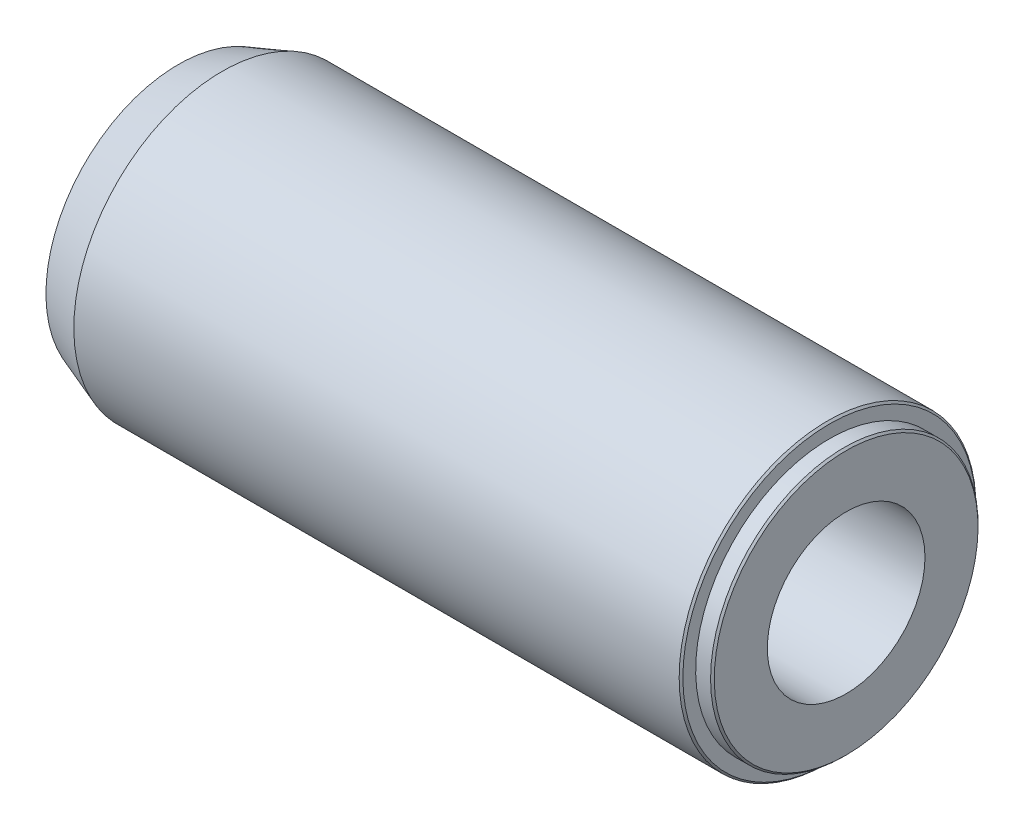
ISO-10303-21;
HEADER;
FILE_DESCRIPTION(('STEP AP214'),'2;1');
FILE_NAME('part.step','',(''),(''),'','','');
FILE_SCHEMA(('AUTOMOTIVE_DESIGN { 1 0 10303 214 1 1 1 1 }'));
ENDSEC;
DATA;
#1=APPLICATION_CONTEXT('core data for automotive mechanical design processes');
#2=APPLICATION_PROTOCOL_DEFINITION('international standard','automotive_design',2000,#1);
#3=PRODUCT_CONTEXT('',#1,'mechanical');
#4=PRODUCT('Part','Part','',(#3));
#5=PRODUCT_RELATED_PRODUCT_CATEGORY('part','',(#4));
#6=PRODUCT_DEFINITION_FORMATION('','',#4);
#7=PRODUCT_DEFINITION_CONTEXT('part definition',#1,'design');
#8=PRODUCT_DEFINITION('design','',#6,#7);
#9=PRODUCT_DEFINITION_SHAPE('','',#8);
#10=(LENGTH_UNIT() NAMED_UNIT(*) SI_UNIT(.MILLI.,.METRE.));
#11=(NAMED_UNIT(*) PLANE_ANGLE_UNIT() SI_UNIT($,.RADIAN.));
#12=(NAMED_UNIT(*) SI_UNIT($,.STERADIAN.) SOLID_ANGLE_UNIT());
#13=UNCERTAINTY_MEASURE_WITH_UNIT(LENGTH_MEASURE(1.E-05),#10,'distance_accuracy_value','');
#14=(GEOMETRIC_REPRESENTATION_CONTEXT(3) GLOBAL_UNCERTAINTY_ASSIGNED_CONTEXT((#13)) GLOBAL_UNIT_ASSIGNED_CONTEXT((#10,
#11,#12)) REPRESENTATION_CONTEXT('',''));
#15=CARTESIAN_POINT('',(0.,0.,0.));
#16=DIRECTION('',(0.,0.,1.));
#17=DIRECTION('',(1.,0.,0.));
#18=AXIS2_PLACEMENT_3D('',#15,#16,#17);
#19=CARTESIAN_POINT('',(-38.0967257246824,-0.00277487997396835,0.));
#20=DIRECTION('',(-1.,0.,0.));
#21=DIRECTION('',(0.,-1.,0.));
#22=AXIS2_PLACEMENT_3D('',#19,#20,#21);
#23=CYLINDRICAL_SURFACE('',#22,7.21024238);
#24=CARTESIAN_POINT('',(-2.1967257246824,-0.00277487997396835,0.));
#25=DIRECTION('',(-1.,0.,0.));
#26=DIRECTION('',(0.,0.,1.));
#27=AXIS2_PLACEMENT_3D('',#24,#25,#26);
#28=CIRCLE('',#27,7.21024238);
#29=CARTESIAN_POINT('',(-2.1967257246824,-0.00277487997396835,7.21024238));
#30=VERTEX_POINT('',#29);
#31=EDGE_CURVE('E192',#30,#30,#28,.T.);
#32=ORIENTED_EDGE('',*,*,#31,.T.);
#33=EDGE_LOOP('',(#32));
#34=FACE_BOUND('',#33,.T.);
#35=CARTESIAN_POINT('',(-2.999999999994,-0.00277487997396835,0.));
#36=DIRECTION('',(-1.,0.,0.));
#37=DIRECTION('',(0.,-1.,0.));
#38=AXIS2_PLACEMENT_3D('',#35,#36,#37);
#39=CIRCLE('',#38,7.21024238);
#40=CARTESIAN_POINT('',(-2.999999999994,-7.21301725997397,0.));
#41=VERTEX_POINT('',#40);
#42=EDGE_CURVE('E188',#41,#41,#39,.T.);
#43=ORIENTED_EDGE('',*,*,#42,.F.);
#44=EDGE_LOOP('',(#43));
#45=FACE_BOUND('',#44,.T.);
#46=ADVANCED_FACE('F51',(#34,#45),#23,.T.);
#47=CARTESIAN_POINT('',(-2.999999999994,7.99722512002603,0.));
#48=DIRECTION('',(-1.,0.,0.));
#49=DIRECTION('',(0.,-1.,0.));
#50=AXIS2_PLACEMENT_3D('',#47,#48,#49);
#51=PLANE('',#50);
#52=CARTESIAN_POINT('',(-2.999999999994,-0.00277487997396835,0.));
#53=DIRECTION('',(-1.,0.,0.));
#54=DIRECTION('',(0.,-1.,0.));
#55=AXIS2_PLACEMENT_3D('',#52,#53,#54);
#56=CIRCLE('',#55,7.89999999999999);
#57=CARTESIAN_POINT('',(-2.999999999994,-7.90277487997396,0.));
#58=VERTEX_POINT('',#57);
#59=EDGE_CURVE('E11',#58,#58,#56,.F.);
#60=ORIENTED_EDGE('',*,*,#59,.T.);
#61=EDGE_LOOP('',(#60));
#62=FACE_BOUND('',#61,.T.);
#63=ORIENTED_EDGE('',*,*,#42,.T.);
#64=EDGE_LOOP('',(#63));
#65=FACE_BOUND('',#64,.T.);
#66=ADVANCED_FACE('F222',(#62,#65),#51,.F.);
#67=CARTESIAN_POINT('',(-38.0967257246824,-0.00277487997396835,0.));
#68=DIRECTION('',(-1.,0.,0.));
#69=DIRECTION('',(0.,-1.,0.));
#70=AXIS2_PLACEMENT_3D('',#67,#68,#69);
#71=CYLINDRICAL_SURFACE('',#70,8.);
#72=CARTESIAN_POINT('',(-3.099999999994,-0.00277487997396835,0.));
#73=DIRECTION('',(-1.,0.,0.));
#74=DIRECTION('',(0.,0.,1.));
#75=AXIS2_PLACEMENT_3D('',#72,#73,#74);
#76=CIRCLE('',#75,8.);
#77=CARTESIAN_POINT('',(-3.099999999994,-0.00277487997396835,8.));
#78=VERTEX_POINT('',#77);
#79=EDGE_CURVE('E61',#78,#78,#76,.T.);
#80=ORIENTED_EDGE('',*,*,#79,.T.);
#81=EDGE_LOOP('',(#80));
#82=FACE_BOUND('',#81,.T.);
#83=CARTESIAN_POINT('',(-35.7343296651528,-0.00277487997396835,0.));
#84=DIRECTION('',(-1.,0.,0.));
#85=DIRECTION('',(0.,-1.,0.));
#86=AXIS2_PLACEMENT_3D('',#83,#84,#85);
#87=CIRCLE('',#86,7.99999999999999);
#88=CARTESIAN_POINT('',(-35.7343296651528,-8.00277487997396,0.));
#89=VERTEX_POINT('',#88);
#90=EDGE_CURVE('E184',#89,#89,#87,.T.);
#91=ORIENTED_EDGE('',*,*,#90,.F.);
#92=EDGE_LOOP('',(#91));
#93=FACE_BOUND('',#92,.T.);
#94=ADVANCED_FACE('F204',(#82,#93),#71,.T.);
#95=CARTESIAN_POINT('',(-35.7343296651528,-0.00277487997396835,0.));
#96=DIRECTION('',(1.,0.,0.));
#97=DIRECTION('',(0.,1.,0.));
#98=AXIS2_PLACEMENT_3D('',#95,#96,#97);
#99=CONICAL_SURFACE('',#98,7.99999999999999,0.349065850398861);
#100=CARTESIAN_POINT('',(-38.0967257246824,-0.00277487997396835,0.));
#101=DIRECTION('',(-1.,0.,0.));
#102=DIRECTION('',(0.,-1.,0.));
#103=AXIS2_PLACEMENT_3D('',#100,#101,#102);
#104=CIRCLE('',#103,7.14015815278347);
#105=CARTESIAN_POINT('',(-38.0967257246824,-7.14293303275744,0.));
#106=VERTEX_POINT('',#105);
#107=EDGE_CURVE('E171',#106,#106,#104,.T.);
#108=ORIENTED_EDGE('',*,*,#107,.F.);
#109=EDGE_LOOP('',(#108));
#110=FACE_BOUND('',#109,.T.);
#111=ORIENTED_EDGE('',*,*,#90,.T.);
#112=EDGE_LOOP('',(#111));
#113=FACE_BOUND('',#112,.T.);
#114=ADVANCED_FACE('F240',(#110,#113),#99,.T.);
#115=CARTESIAN_POINT('',(-38.0967257246824,7.1373832728095,0.));
#116=DIRECTION('',(1.,0.,0.));
#117=DIRECTION('',(0.,1.,0.));
#118=AXIS2_PLACEMENT_3D('',#115,#116,#117);
#119=PLANE('',#118);
#120=DIRECTION('',(0.,0.500000000000001,0.866025403784438));
#121=VECTOR('',#120,1.);
#122=CARTESIAN_POINT('',(-38.0967257246824,-3.15676075174478,0.));
#123=LINE('',#122,#121);
#124=CARTESIAN_POINT('',(-38.0967257246824,-3.15676075174479,0.));
#125=VERTEX_POINT('',#124);
#126=CARTESIAN_POINT('',(-38.0967257246824,-1.57838037587239,2.73383500468065));
#127=VERTEX_POINT('',#126);
#128=EDGE_CURVE('E151',#125,#127,#123,.T.);
#129=ORIENTED_EDGE('',*,*,#128,.F.);
#130=DIRECTION('',(0.,-0.499999999999995,0.866025403784442));
#131=VECTOR('',#130,1.);
#132=CARTESIAN_POINT('',(-38.0967257246824,-1.57838037587242,-2.73383500468063));
#133=LINE('',#132,#131);
#134=CARTESIAN_POINT('',(-38.0967257246824,-1.57838037587242,-2.73383500468063));
#135=VERTEX_POINT('',#134);
#136=EDGE_CURVE('E68',#135,#125,#133,.T.);
#137=ORIENTED_EDGE('',*,*,#136,.F.);
#138=DIRECTION('',(0.,-1.,0.));
#139=VECTOR('',#138,1.);
#140=CARTESIAN_POINT('',(-38.0967257246824,1.57838037587237,-2.73383500468066));
#141=LINE('',#140,#139);
#142=CARTESIAN_POINT('',(-38.0967257246824,1.57838037587237,-2.73383500468066));
#143=VERTEX_POINT('',#142);
#144=EDGE_CURVE('E165',#143,#135,#141,.T.);
#145=ORIENTED_EDGE('',*,*,#144,.F.);
#146=DIRECTION('',(0.,-0.500000000000007,-0.866025403784435));
#147=VECTOR('',#146,1.);
#148=CARTESIAN_POINT('',(-38.0967257246824,3.15676075174478,0.));
#149=LINE('',#148,#147);
#150=CARTESIAN_POINT('',(-38.0967257246824,3.15676075174478,0.));
#151=VERTEX_POINT('',#150);
#152=EDGE_CURVE('E162',#151,#143,#149,.T.);
#153=ORIENTED_EDGE('',*,*,#152,.F.);
#154=DIRECTION('',(0.,0.499999999999995,-0.866025403784442));
#155=VECTOR('',#154,1.);
#156=CARTESIAN_POINT('',(-38.0967257246824,1.5783803758724,2.73383500468064));
#157=LINE('',#156,#155);
#158=CARTESIAN_POINT('',(-38.0967257246824,1.5783803758724,2.73383500468064));
#159=VERTEX_POINT('',#158);
#160=EDGE_CURVE('E118',#159,#151,#157,.T.);
#161=ORIENTED_EDGE('',*,*,#160,.F.);
#162=DIRECTION('',(0.,1.,0.));
#163=VECTOR('',#162,1.);
#164=CARTESIAN_POINT('',(-38.0967257246824,-1.57838037587239,2.73383500468065));
#165=LINE('',#164,#163);
#166=EDGE_CURVE('E156',#127,#159,#165,.T.);
#167=ORIENTED_EDGE('',*,*,#166,.F.);
#168=EDGE_LOOP('',(#129,#137,#145,#153,#161,#167));
#169=FACE_BOUND('',#168,.T.);
#170=ORIENTED_EDGE('',*,*,#107,.T.);
#171=EDGE_LOOP('',(#170));
#172=FACE_BOUND('',#171,.T.);
#173=ADVANCED_FACE('F243',(#169,#172),#119,.F.);
#174=CARTESIAN_POINT('',(-2.0967257246824,7.20746750002603,0.));
#175=DIRECTION('',(-1.,0.,0.));
#176=DIRECTION('',(0.,-1.,0.));
#177=AXIS2_PLACEMENT_3D('',#174,#175,#176);
#178=PLANE('',#177);
#179=CARTESIAN_POINT('',(-2.0967257246824,0.,0.));
#180=DIRECTION('',(1.,0.,0.));
#181=DIRECTION('',(0.,0.,-1.));
#182=AXIS2_PLACEMENT_3D('',#179,#180,#181);
#183=CIRCLE('',#182,4.25);
#184=CARTESIAN_POINT('',(-2.0967257246824,0.,-4.25));
#185=VERTEX_POINT('',#184);
#186=EDGE_CURVE('E280',#185,#185,#183,.T.);
#187=ORIENTED_EDGE('',*,*,#186,.F.);
#188=EDGE_LOOP('',(#187));
#189=FACE_BOUND('',#188,.T.);
#190=CARTESIAN_POINT('',(-2.0967257246824,-0.00277487997396835,0.));
#191=DIRECTION('',(-1.,0.,0.));
#192=DIRECTION('',(0.,-1.,0.));
#193=AXIS2_PLACEMENT_3D('',#190,#191,#192);
#194=CIRCLE('',#193,7.11024238);
#195=CARTESIAN_POINT('',(-2.0967257246824,-7.11301725997397,0.));
#196=VERTEX_POINT('',#195);
#197=EDGE_CURVE('E196',#196,#196,#194,.F.);
#198=ORIENTED_EDGE('',*,*,#197,.T.);
#199=EDGE_LOOP('',(#198));
#200=FACE_BOUND('',#199,.T.);
#201=ADVANCED_FACE('F247',(#189,#200),#178,.F.);
#202=CARTESIAN_POINT('',(-33.0967257246824,-1.57838037587242,-2.73383500468063));
#203=DIRECTION('',(0.,-0.866025403784442,-0.499999999999995));
#204=DIRECTION('',(0.,0.499999999999995,-0.866025403784442));
#205=AXIS2_PLACEMENT_3D('',#202,#203,#204);
#206=PLANE('',#205);
#207=ORIENTED_EDGE('',*,*,#136,.T.);
#208=DIRECTION('',(-1.,0.,0.));
#209=VECTOR('',#208,1.);
#210=CARTESIAN_POINT('',(-33.0967257246824,-3.15676075174478,0.));
#211=LINE('',#210,#209);
#212=CARTESIAN_POINT('',(-33.0967257246824,-3.15676075174478,0.));
#213=VERTEX_POINT('',#212);
#214=EDGE_CURVE('E99',#213,#125,#211,.T.);
#215=ORIENTED_EDGE('',*,*,#214,.F.);
#216=DIRECTION('',(0.,-0.499999999999995,0.866025403784442));
#217=VECTOR('',#216,1.);
#218=CARTESIAN_POINT('',(-33.0967257246824,-1.57838037587242,-2.73383500468063));
#219=LINE('',#218,#217);
#220=CARTESIAN_POINT('',(-33.0967257246824,-1.57838037587242,-2.73383500468063));
#221=VERTEX_POINT('',#220);
#222=EDGE_CURVE('E168',#221,#213,#219,.T.);
#223=ORIENTED_EDGE('',*,*,#222,.F.);
#224=DIRECTION('',(-1.,0.,0.));
#225=VECTOR('',#224,1.);
#226=CARTESIAN_POINT('',(-33.0967257246824,-1.57838037587242,-2.73383500468063));
#227=LINE('',#226,#225);
#228=EDGE_CURVE('E76',#221,#135,#227,.T.);
#229=ORIENTED_EDGE('',*,*,#228,.T.);
#230=EDGE_LOOP('',(#207,#215,#223,#229));
#231=FACE_BOUND('',#230,.T.);
#232=ADVANCED_FACE('F251',(#231),#206,.F.);
#233=CARTESIAN_POINT('',(-33.0967257246824,1.57838037587237,-2.73383500468066));
#234=DIRECTION('',(0.,0.,-1.));
#235=DIRECTION('',(0.,1.,0.));
#236=AXIS2_PLACEMENT_3D('',#233,#234,#235);
#237=PLANE('',#236);
#238=ORIENTED_EDGE('',*,*,#144,.T.);
#239=ORIENTED_EDGE('',*,*,#228,.F.);
#240=DIRECTION('',(0.,-1.,0.));
#241=VECTOR('',#240,1.);
#242=CARTESIAN_POINT('',(-33.0967257246824,1.57838037587237,-2.73383500468066));
#243=LINE('',#242,#241);
#244=CARTESIAN_POINT('',(-33.0967257246824,1.57838037587237,-2.73383500468066));
#245=VERTEX_POINT('',#244);
#246=EDGE_CURVE('E132',#245,#221,#243,.T.);
#247=ORIENTED_EDGE('',*,*,#246,.F.);
#248=DIRECTION('',(-1.,0.,0.));
#249=VECTOR('',#248,1.);
#250=CARTESIAN_POINT('',(-33.0967257246824,1.57838037587237,-2.73383500468066));
#251=LINE('',#250,#249);
#252=EDGE_CURVE('E123',#245,#143,#251,.T.);
#253=ORIENTED_EDGE('',*,*,#252,.T.);
#254=EDGE_LOOP('',(#238,#239,#247,#253));
#255=FACE_BOUND('',#254,.T.);
#256=ADVANCED_FACE('F255',(#255),#237,.F.);
#257=CARTESIAN_POINT('',(-33.0967257246824,3.15676075174478,0.));
#258=DIRECTION('',(0.,0.866025403784434,-0.500000000000007));
#259=DIRECTION('',(0.,0.500000000000007,0.866025403784435));
#260=AXIS2_PLACEMENT_3D('',#257,#258,#259);
#261=PLANE('',#260);
#262=ORIENTED_EDGE('',*,*,#152,.T.);
#263=ORIENTED_EDGE('',*,*,#252,.F.);
#264=DIRECTION('',(0.,-0.500000000000007,-0.866025403784435));
#265=VECTOR('',#264,1.);
#266=CARTESIAN_POINT('',(-33.0967257246824,3.15676075174478,0.));
#267=LINE('',#266,#265);
#268=CARTESIAN_POINT('',(-33.0967257246824,3.15676075174478,0.));
#269=VERTEX_POINT('',#268);
#270=EDGE_CURVE('E127',#269,#245,#267,.T.);
#271=ORIENTED_EDGE('',*,*,#270,.F.);
#272=DIRECTION('',(-1.,0.,0.));
#273=VECTOR('',#272,1.);
#274=CARTESIAN_POINT('',(-33.0967257246824,3.15676075174478,0.));
#275=LINE('',#274,#273);
#276=EDGE_CURVE('E111',#269,#151,#275,.T.);
#277=ORIENTED_EDGE('',*,*,#276,.T.);
#278=EDGE_LOOP('',(#262,#263,#271,#277));
#279=FACE_BOUND('',#278,.T.);
#280=ADVANCED_FACE('F128',(#279),#261,.F.);
#281=CARTESIAN_POINT('',(-33.0967257246824,1.5783803758724,2.73383500468064));
#282=DIRECTION('',(0.,0.866025403784442,0.499999999999995));
#283=DIRECTION('',(0.,-0.499999999999995,0.866025403784442));
#284=AXIS2_PLACEMENT_3D('',#281,#282,#283);
#285=PLANE('',#284);
#286=ORIENTED_EDGE('',*,*,#160,.T.);
#287=ORIENTED_EDGE('',*,*,#276,.F.);
#288=DIRECTION('',(0.,0.499999999999995,-0.866025403784442));
#289=VECTOR('',#288,1.);
#290=CARTESIAN_POINT('',(-33.0967257246824,1.5783803758724,2.73383500468064));
#291=LINE('',#290,#289);
#292=CARTESIAN_POINT('',(-33.0967257246824,1.5783803758724,2.73383500468064));
#293=VERTEX_POINT('',#292);
#294=EDGE_CURVE('E115',#293,#269,#291,.T.);
#295=ORIENTED_EDGE('',*,*,#294,.F.);
#296=DIRECTION('',(-1.,0.,0.));
#297=VECTOR('',#296,1.);
#298=CARTESIAN_POINT('',(-33.0967257246824,1.5783803758724,2.73383500468064));
#299=LINE('',#298,#297);
#300=EDGE_CURVE('E124',#293,#159,#299,.T.);
#301=ORIENTED_EDGE('',*,*,#300,.T.);
#302=EDGE_LOOP('',(#286,#287,#295,#301));
#303=FACE_BOUND('',#302,.T.);
#304=ADVANCED_FACE('F113',(#303),#285,.F.);
#305=CARTESIAN_POINT('',(-33.0967257246824,-1.57838037587239,2.73383500468065));
#306=DIRECTION('',(0.,0.,1.));
#307=DIRECTION('',(0.,-1.,0.));
#308=AXIS2_PLACEMENT_3D('',#305,#306,#307);
#309=PLANE('',#308);
#310=ORIENTED_EDGE('',*,*,#166,.T.);
#311=ORIENTED_EDGE('',*,*,#300,.F.);
#312=DIRECTION('',(0.,1.,0.));
#313=VECTOR('',#312,1.);
#314=CARTESIAN_POINT('',(-33.0967257246824,-1.57838037587239,2.73383500468065));
#315=LINE('',#314,#313);
#316=CARTESIAN_POINT('',(-33.0967257246824,-1.57838037587239,2.73383500468065));
#317=VERTEX_POINT('',#316);
#318=EDGE_CURVE('E138',#317,#293,#315,.T.);
#319=ORIENTED_EDGE('',*,*,#318,.F.);
#320=DIRECTION('',(-1.,0.,0.));
#321=VECTOR('',#320,1.);
#322=CARTESIAN_POINT('',(-33.0967257246824,-1.57838037587239,2.73383500468065));
#323=LINE('',#322,#321);
#324=EDGE_CURVE('E176',#317,#127,#323,.T.);
#325=ORIENTED_EDGE('',*,*,#324,.T.);
#326=EDGE_LOOP('',(#310,#311,#319,#325));
#327=FACE_BOUND('',#326,.T.);
#328=ADVANCED_FACE('F259',(#327),#309,.F.);
#329=CARTESIAN_POINT('',(-33.0967257246824,-3.15676075174478,0.));
#330=DIRECTION('',(0.,-0.866025403784438,0.500000000000001));
#331=DIRECTION('',(0.,-0.500000000000001,-0.866025403784438));
#332=AXIS2_PLACEMENT_3D('',#329,#330,#331);
#333=PLANE('',#332);
#334=ORIENTED_EDGE('',*,*,#128,.T.);
#335=ORIENTED_EDGE('',*,*,#324,.F.);
#336=DIRECTION('',(0.,0.500000000000001,0.866025403784438));
#337=VECTOR('',#336,1.);
#338=CARTESIAN_POINT('',(-33.0967257246824,-3.15676075174478,0.));
#339=LINE('',#338,#337);
#340=EDGE_CURVE('E143',#213,#317,#339,.T.);
#341=ORIENTED_EDGE('',*,*,#340,.F.);
#342=ORIENTED_EDGE('',*,*,#214,.T.);
#343=EDGE_LOOP('',(#334,#335,#341,#342));
#344=FACE_BOUND('',#343,.T.);
#345=ADVANCED_FACE('F256',(#344),#333,.F.);
#346=CARTESIAN_POINT('',(-33.0967257246824,0.,0.));
#347=DIRECTION('',(-1.,0.,0.));
#348=DIRECTION('',(0.,0.,1.));
#349=AXIS2_PLACEMENT_3D('',#346,#347,#348);
#350=PLANE('',#349);
#351=ORIENTED_EDGE('',*,*,#222,.T.);
#352=ORIENTED_EDGE('',*,*,#340,.T.);
#353=ORIENTED_EDGE('',*,*,#318,.T.);
#354=ORIENTED_EDGE('',*,*,#294,.T.);
#355=ORIENTED_EDGE('',*,*,#270,.T.);
#356=ORIENTED_EDGE('',*,*,#246,.T.);
#357=EDGE_LOOP('',(#351,#352,#353,#354,#355,#356));
#358=FACE_BOUND('',#357,.T.);
#359=ADVANCED_FACE('F135',(#358),#350,.T.);
#360=CARTESIAN_POINT('',(-2.1967257246824,-0.00277487997396835,0.));
#361=DIRECTION('',(-1.,0.,0.));
#362=DIRECTION('',(0.,0.,1.));
#363=AXIS2_PLACEMENT_3D('',#360,#361,#362);
#364=CONICAL_SURFACE('',#363,7.21024238,0.785398163397457);
#365=ORIENTED_EDGE('',*,*,#197,.F.);
#366=EDGE_LOOP('',(#365));
#367=FACE_BOUND('',#366,.T.);
#368=ORIENTED_EDGE('',*,*,#31,.F.);
#369=EDGE_LOOP('',(#368));
#370=FACE_BOUND('',#369,.T.);
#371=ADVANCED_FACE('F209',(#367,#370),#364,.T.);
#372=CARTESIAN_POINT('',(-3.099999999994,-0.00277487997396835,0.));
#373=DIRECTION('',(-1.,0.,0.));
#374=DIRECTION('',(0.,0.,1.));
#375=AXIS2_PLACEMENT_3D('',#372,#373,#374);
#376=CONICAL_SURFACE('',#375,8.,0.78539816339744);
#377=ORIENTED_EDGE('',*,*,#59,.F.);
#378=EDGE_LOOP('',(#377));
#379=FACE_BOUND('',#378,.T.);
#380=ORIENTED_EDGE('',*,*,#79,.F.);
#381=EDGE_LOOP('',(#380));
#382=FACE_BOUND('',#381,.T.);
#383=ADVANCED_FACE('F54',(#379,#382),#376,.T.);
#384=CARTESIAN_POINT('',(-27.0967257246824,0.,0.));
#385=DIRECTION('',(1.,0.,0.));
#386=DIRECTION('',(0.,0.,-1.));
#387=AXIS2_PLACEMENT_3D('',#384,#385,#386);
#388=CONICAL_SURFACE('',#387,4.24999999999999,1.02974425867665);
#389=CARTESIAN_POINT('',(-29.6503833555495,0.,0.));
#390=VERTEX_POINT('',#389);
#391=VERTEX_LOOP('',#390);
#392=FACE_BOUND('',#391,.T.);
#393=CARTESIAN_POINT('',(-27.0967257246824,0.,0.));
#394=DIRECTION('',(1.,0.,0.));
#395=DIRECTION('',(0.,0.,-1.));
#396=AXIS2_PLACEMENT_3D('',#393,#394,#395);
#397=CIRCLE('',#396,4.24999999999999);
#398=CARTESIAN_POINT('',(-27.0967257246824,0.,-4.24999999999999));
#399=VERTEX_POINT('',#398);
#400=EDGE_CURVE('E152',#399,#399,#397,.T.);
#401=ORIENTED_EDGE('',*,*,#400,.T.);
#402=EDGE_LOOP('',(#401));
#403=FACE_BOUND('',#402,.T.);
#404=ADVANCED_FACE('F208',(#392,#403),#388,.F.);
#405=CARTESIAN_POINT('',(-2.0967257246824,0.,0.));
#406=DIRECTION('',(1.,0.,0.));
#407=DIRECTION('',(0.,0.,-1.));
#408=AXIS2_PLACEMENT_3D('',#405,#406,#407);
#409=CYLINDRICAL_SURFACE('',#408,4.25);
#410=ORIENTED_EDGE('',*,*,#400,.F.);
#411=EDGE_LOOP('',(#410));
#412=FACE_BOUND('',#411,.T.);
#413=ORIENTED_EDGE('',*,*,#186,.T.);
#414=EDGE_LOOP('',(#413));
#415=FACE_BOUND('',#414,.T.);
#416=ADVANCED_FACE('F216',(#412,#415),#409,.F.);
#417=CLOSED_SHELL('',(#46,#66,#94,#114,#173,#201,#232,#256,#280,#304,#328,#345,#359,#371,#383,
#404,#416));
#418=MANIFOLD_SOLID_BREP('B2',#417);
#419=ADVANCED_BREP_SHAPE_REPRESENTATION('',(#18,#418),#14);
#420=SHAPE_DEFINITION_REPRESENTATION(#9,#419);
ENDSEC;
END-ISO-10303-21;
